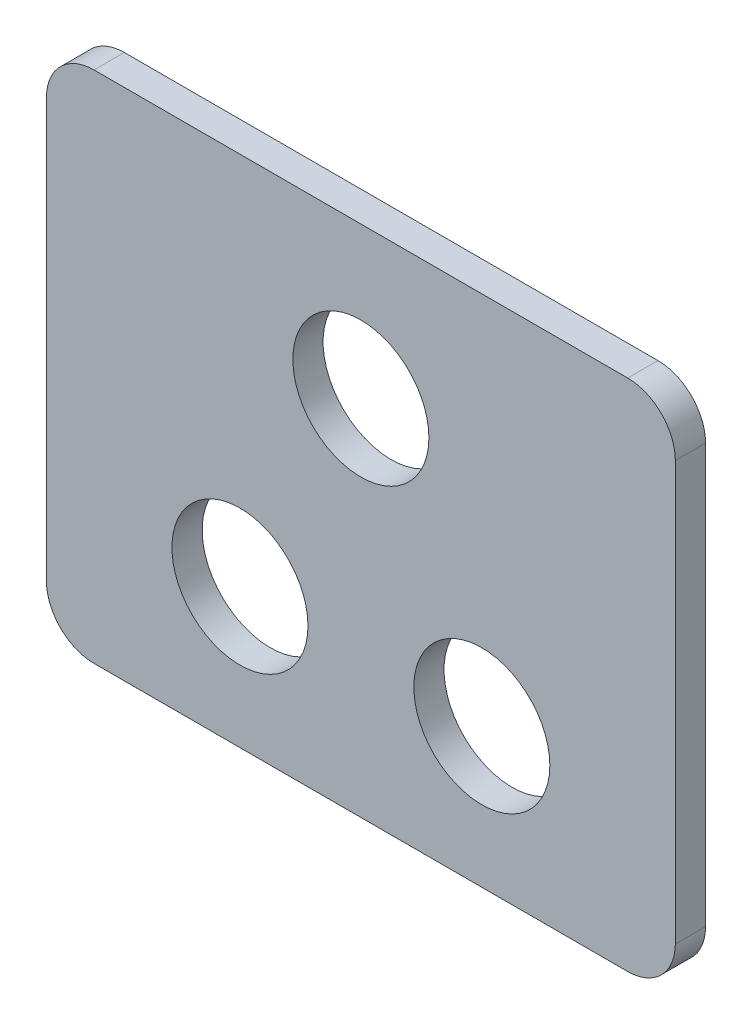
ISO-10303-21;
HEADER;
FILE_DESCRIPTION(('STEP AP214'),'2;1');
FILE_NAME('part.step','',(''),(''),'','','');
FILE_SCHEMA(('AUTOMOTIVE_DESIGN { 1 0 10303 214 1 1 1 1 }'));
ENDSEC;
DATA;
#1=APPLICATION_CONTEXT('core data for automotive mechanical design processes');
#2=APPLICATION_PROTOCOL_DEFINITION('international standard','automotive_design',2000,#1);
#3=PRODUCT_CONTEXT('',#1,'mechanical');
#4=PRODUCT('Part','Part','',(#3));
#5=PRODUCT_RELATED_PRODUCT_CATEGORY('part','',(#4));
#6=PRODUCT_DEFINITION_FORMATION('','',#4);
#7=PRODUCT_DEFINITION_CONTEXT('part definition',#1,'design');
#8=PRODUCT_DEFINITION('design','',#6,#7);
#9=PRODUCT_DEFINITION_SHAPE('','',#8);
#10=(LENGTH_UNIT() NAMED_UNIT(*) SI_UNIT(.MILLI.,.METRE.));
#11=(NAMED_UNIT(*) PLANE_ANGLE_UNIT() SI_UNIT($,.RADIAN.));
#12=(NAMED_UNIT(*) SI_UNIT($,.STERADIAN.) SOLID_ANGLE_UNIT());
#13=UNCERTAINTY_MEASURE_WITH_UNIT(LENGTH_MEASURE(1.E-05),#10,'distance_accuracy_value','');
#14=(GEOMETRIC_REPRESENTATION_CONTEXT(3) GLOBAL_UNCERTAINTY_ASSIGNED_CONTEXT((#13)) GLOBAL_UNIT_ASSIGNED_CONTEXT((#10,
#11,#12)) REPRESENTATION_CONTEXT('',''));
#15=CARTESIAN_POINT('',(0.,0.,0.));
#16=DIRECTION('',(0.,0.,1.));
#17=DIRECTION('',(1.,0.,0.));
#18=AXIS2_PLACEMENT_3D('',#15,#16,#17);
#19=CARTESIAN_POINT('',(32.0626569531529,-35.3645038979217,6.35));
#20=DIRECTION('',(0.,0.,-1.));
#21=DIRECTION('',(-1.,0.,0.));
#22=AXIS2_PLACEMENT_3D('',#19,#20,#21);
#23=CYLINDRICAL_SURFACE('',#22,10.);
#24=CARTESIAN_POINT('',(32.0626569531529,-35.3645038979217,0.));
#25=DIRECTION('',(0.,0.,1.));
#26=DIRECTION('',(1.,0.,0.));
#27=AXIS2_PLACEMENT_3D('',#24,#25,#26);
#28=CIRCLE('',#27,10.);
#29=CARTESIAN_POINT('',(32.0626569531529,-25.3645038979217,0.));
#30=VERTEX_POINT('',#29);
#31=CARTESIAN_POINT('',(42.0626569531529,-35.3645038979217,0.));
#32=VERTEX_POINT('',#31);
#33=EDGE_CURVE('E159',#30,#32,#28,.F.);
#34=ORIENTED_EDGE('',*,*,#33,.F.);
#35=DIRECTION('',(0.,0.,-1.));
#36=VECTOR('',#35,1.);
#37=CARTESIAN_POINT('',(32.0626569531529,-25.3645038979217,6.35));
#38=LINE('',#37,#36);
#39=CARTESIAN_POINT('',(32.0626569531529,-25.3645038979217,6.35));
#40=VERTEX_POINT('',#39);
#41=EDGE_CURVE('E11',#40,#30,#38,.T.);
#42=ORIENTED_EDGE('',*,*,#41,.F.);
#43=CARTESIAN_POINT('',(32.0626569531529,-35.3645038979217,6.35));
#44=DIRECTION('',(0.,0.,1.));
#45=DIRECTION('',(1.,0.,0.));
#46=AXIS2_PLACEMENT_3D('',#43,#44,#45);
#47=CIRCLE('',#46,10.);
#48=CARTESIAN_POINT('',(42.0626569531529,-35.3645038979217,6.35));
#49=VERTEX_POINT('',#48);
#50=EDGE_CURVE('E236',#40,#49,#47,.F.);
#51=ORIENTED_EDGE('',*,*,#50,.T.);
#52=DIRECTION('',(0.,0.,-1.));
#53=VECTOR('',#52,1.);
#54=CARTESIAN_POINT('',(42.0626569531529,-35.3645038979217,6.35));
#55=LINE('',#54,#53);
#56=EDGE_CURVE('E54',#49,#32,#55,.T.);
#57=ORIENTED_EDGE('',*,*,#56,.T.);
#58=EDGE_LOOP('',(#34,#42,#51,#57));
#59=FACE_BOUND('',#58,.T.);
#60=ADVANCED_FACE('F37',(#59),#23,.T.);
#61=CARTESIAN_POINT('',(0.,-25.3645038979217,6.35));
#62=DIRECTION('',(0.,1.,0.));
#63=DIRECTION('',(0.,0.,1.));
#64=AXIS2_PLACEMENT_3D('',#61,#62,#63);
#65=PLANE('',#64);
#66=DIRECTION('',(1.,0.,0.));
#67=VECTOR('',#66,1.);
#68=CARTESIAN_POINT('',(0.,-25.3645038979217,0.));
#69=LINE('',#68,#67);
#70=CARTESIAN_POINT('',(-80.0173430468471,-25.3645038979217,0.));
#71=VERTEX_POINT('',#70);
#72=EDGE_CURVE('E154',#71,#30,#69,.T.);
#73=ORIENTED_EDGE('',*,*,#72,.F.);
#74=DIRECTION('',(0.,0.,-1.));
#75=VECTOR('',#74,1.);
#76=CARTESIAN_POINT('',(-80.0173430468471,-25.3645038979217,6.35));
#77=LINE('',#76,#75);
#78=CARTESIAN_POINT('',(-80.0173430468471,-25.3645038979217,6.35));
#79=VERTEX_POINT('',#78);
#80=EDGE_CURVE('E46',#79,#71,#77,.T.);
#81=ORIENTED_EDGE('',*,*,#80,.F.);
#82=DIRECTION('',(1.,0.,0.));
#83=VECTOR('',#82,1.);
#84=CARTESIAN_POINT('',(0.,-25.3645038979217,6.35));
#85=LINE('',#84,#83);
#86=EDGE_CURVE('E238',#79,#40,#85,.T.);
#87=ORIENTED_EDGE('',*,*,#86,.T.);
#88=ORIENTED_EDGE('',*,*,#41,.T.);
#89=EDGE_LOOP('',(#73,#81,#87,#88));
#90=FACE_BOUND('',#89,.T.);
#91=ADVANCED_FACE('F158',(#90),#65,.T.);
#92=CARTESIAN_POINT('',(-80.0173430468471,-35.3645038979217,6.35));
#93=DIRECTION('',(0.,0.,-1.));
#94=DIRECTION('',(-1.,0.,0.));
#95=AXIS2_PLACEMENT_3D('',#92,#93,#94);
#96=CYLINDRICAL_SURFACE('',#95,10.);
#97=CARTESIAN_POINT('',(-80.0173430468471,-35.3645038979217,0.));
#98=DIRECTION('',(0.,0.,1.));
#99=DIRECTION('',(1.,0.,0.));
#100=AXIS2_PLACEMENT_3D('',#97,#98,#99);
#101=CIRCLE('',#100,10.);
#102=CARTESIAN_POINT('',(-90.0173430468471,-35.3645038979217,0.));
#103=VERTEX_POINT('',#102);
#104=EDGE_CURVE('E143',#71,#103,#101,.T.);
#105=ORIENTED_EDGE('',*,*,#104,.T.);
#106=DIRECTION('',(0.,0.,-1.));
#107=VECTOR('',#106,1.);
#108=CARTESIAN_POINT('',(-90.0173430468471,-35.3645038979217,6.35));
#109=LINE('',#108,#107);
#110=CARTESIAN_POINT('',(-90.0173430468471,-35.3645038979217,6.35));
#111=VERTEX_POINT('',#110);
#112=EDGE_CURVE('E135',#111,#103,#109,.T.);
#113=ORIENTED_EDGE('',*,*,#112,.F.);
#114=CARTESIAN_POINT('',(-80.0173430468471,-35.3645038979217,6.35));
#115=DIRECTION('',(0.,0.,1.));
#116=DIRECTION('',(1.,0.,0.));
#117=AXIS2_PLACEMENT_3D('',#114,#115,#116);
#118=CIRCLE('',#117,10.);
#119=EDGE_CURVE('E145',#79,#111,#118,.T.);
#120=ORIENTED_EDGE('',*,*,#119,.F.);
#121=ORIENTED_EDGE('',*,*,#80,.T.);
#122=EDGE_LOOP('',(#105,#113,#120,#121));
#123=FACE_BOUND('',#122,.T.);
#124=ADVANCED_FACE('F141',(#123),#96,.T.);
#125=CARTESIAN_POINT('',(-90.0173430468471,0.,6.35));
#126=DIRECTION('',(1.,0.,0.));
#127=DIRECTION('',(0.,1.,0.));
#128=AXIS2_PLACEMENT_3D('',#125,#126,#127);
#129=PLANE('',#128);
#130=DIRECTION('',(0.,-1.,0.));
#131=VECTOR('',#130,1.);
#132=CARTESIAN_POINT('',(-90.0173430468471,0.,0.));
#133=LINE('',#132,#131);
#134=CARTESIAN_POINT('',(-90.0173430468471,-123.314503897922,0.));
#135=VERTEX_POINT('',#134);
#136=EDGE_CURVE('E156',#103,#135,#133,.T.);
#137=ORIENTED_EDGE('',*,*,#136,.T.);
#138=DIRECTION('',(0.,0.,-1.));
#139=VECTOR('',#138,1.);
#140=CARTESIAN_POINT('',(-90.0173430468471,-123.314503897922,6.35));
#141=LINE('',#140,#139);
#142=CARTESIAN_POINT('',(-90.0173430468471,-123.314503897922,6.35));
#143=VERTEX_POINT('',#142);
#144=EDGE_CURVE('E128',#143,#135,#141,.T.);
#145=ORIENTED_EDGE('',*,*,#144,.F.);
#146=DIRECTION('',(0.,-1.,0.));
#147=VECTOR('',#146,1.);
#148=CARTESIAN_POINT('',(-90.0173430468471,0.,6.35));
#149=LINE('',#148,#147);
#150=EDGE_CURVE('E243',#111,#143,#149,.T.);
#151=ORIENTED_EDGE('',*,*,#150,.F.);
#152=ORIENTED_EDGE('',*,*,#112,.T.);
#153=EDGE_LOOP('',(#137,#145,#151,#152));
#154=FACE_BOUND('',#153,.T.);
#155=ADVANCED_FACE('F214',(#154),#129,.F.);
#156=CARTESIAN_POINT('',(-80.0173430468471,-123.314503897922,6.35));
#157=DIRECTION('',(0.,0.,-1.));
#158=DIRECTION('',(-1.,0.,0.));
#159=AXIS2_PLACEMENT_3D('',#156,#157,#158);
#160=CYLINDRICAL_SURFACE('',#159,9.99999999999999);
#161=CARTESIAN_POINT('',(-80.0173430468471,-123.314503897922,0.));
#162=DIRECTION('',(0.,0.,1.));
#163=DIRECTION('',(1.,0.,0.));
#164=AXIS2_PLACEMENT_3D('',#161,#162,#163);
#165=CIRCLE('',#164,9.99999999999999);
#166=CARTESIAN_POINT('',(-80.0173430468471,-133.314503897922,0.));
#167=VERTEX_POINT('',#166);
#168=EDGE_CURVE('E166',#135,#167,#165,.T.);
#169=ORIENTED_EDGE('',*,*,#168,.T.);
#170=DIRECTION('',(0.,0.,-1.));
#171=VECTOR('',#170,1.);
#172=CARTESIAN_POINT('',(-80.0173430468471,-133.314503897922,6.35));
#173=LINE('',#172,#171);
#174=CARTESIAN_POINT('',(-80.0173430468471,-133.314503897922,6.35));
#175=VERTEX_POINT('',#174);
#176=EDGE_CURVE('E126',#175,#167,#173,.T.);
#177=ORIENTED_EDGE('',*,*,#176,.F.);
#178=CARTESIAN_POINT('',(-80.0173430468471,-123.314503897922,6.35));
#179=DIRECTION('',(0.,0.,1.));
#180=DIRECTION('',(1.,0.,0.));
#181=AXIS2_PLACEMENT_3D('',#178,#179,#180);
#182=CIRCLE('',#181,9.99999999999999);
#183=EDGE_CURVE('E119',#143,#175,#182,.T.);
#184=ORIENTED_EDGE('',*,*,#183,.F.);
#185=ORIENTED_EDGE('',*,*,#144,.T.);
#186=EDGE_LOOP('',(#169,#177,#184,#185));
#187=FACE_BOUND('',#186,.T.);
#188=ADVANCED_FACE('F217',(#187),#160,.T.);
#189=CARTESIAN_POINT('',(0.,-133.314503897922,6.35));
#190=DIRECTION('',(0.,1.,0.));
#191=DIRECTION('',(0.,0.,1.));
#192=AXIS2_PLACEMENT_3D('',#189,#190,#191);
#193=PLANE('',#192);
#194=DIRECTION('',(1.,0.,0.));
#195=VECTOR('',#194,1.);
#196=CARTESIAN_POINT('',(0.,-133.314503897922,0.));
#197=LINE('',#196,#195);
#198=CARTESIAN_POINT('',(32.0626569531529,-133.314503897922,0.));
#199=VERTEX_POINT('',#198);
#200=EDGE_CURVE('E125',#167,#199,#197,.T.);
#201=ORIENTED_EDGE('',*,*,#200,.T.);
#202=DIRECTION('',(0.,0.,-1.));
#203=VECTOR('',#202,1.);
#204=CARTESIAN_POINT('',(32.0626569531529,-133.314503897922,6.35));
#205=LINE('',#204,#203);
#206=CARTESIAN_POINT('',(32.0626569531529,-133.314503897922,6.35));
#207=VERTEX_POINT('',#206);
#208=EDGE_CURVE('E108',#207,#199,#205,.T.);
#209=ORIENTED_EDGE('',*,*,#208,.F.);
#210=DIRECTION('',(1.,0.,0.));
#211=VECTOR('',#210,1.);
#212=CARTESIAN_POINT('',(0.,-133.314503897922,6.35));
#213=LINE('',#212,#211);
#214=EDGE_CURVE('E113',#175,#207,#213,.T.);
#215=ORIENTED_EDGE('',*,*,#214,.F.);
#216=ORIENTED_EDGE('',*,*,#176,.T.);
#217=EDGE_LOOP('',(#201,#209,#215,#216));
#218=FACE_BOUND('',#217,.T.);
#219=ADVANCED_FACE('F124',(#218),#193,.F.);
#220=CARTESIAN_POINT('',(32.0626569531529,-123.314503897922,6.35));
#221=DIRECTION('',(0.,0.,-1.));
#222=DIRECTION('',(-1.,0.,0.));
#223=AXIS2_PLACEMENT_3D('',#220,#221,#222);
#224=CYLINDRICAL_SURFACE('',#223,9.99999999999999);
#225=CARTESIAN_POINT('',(32.0626569531529,-123.314503897922,0.));
#226=DIRECTION('',(0.,0.,1.));
#227=DIRECTION('',(1.,0.,0.));
#228=AXIS2_PLACEMENT_3D('',#225,#226,#227);
#229=CIRCLE('',#228,9.99999999999999);
#230=CARTESIAN_POINT('',(42.0626569531529,-123.314503897922,0.));
#231=VERTEX_POINT('',#230);
#232=EDGE_CURVE('E170',#199,#231,#229,.T.);
#233=ORIENTED_EDGE('',*,*,#232,.T.);
#234=DIRECTION('',(0.,0.,-1.));
#235=VECTOR('',#234,1.);
#236=CARTESIAN_POINT('',(42.0626569531529,-123.314503897922,6.35));
#237=LINE('',#236,#235);
#238=CARTESIAN_POINT('',(42.0626569531529,-123.314503897922,6.35));
#239=VERTEX_POINT('',#238);
#240=EDGE_CURVE('E80',#239,#231,#237,.T.);
#241=ORIENTED_EDGE('',*,*,#240,.F.);
#242=CARTESIAN_POINT('',(32.0626569531529,-123.314503897922,6.35));
#243=DIRECTION('',(0.,0.,1.));
#244=DIRECTION('',(1.,0.,0.));
#245=AXIS2_PLACEMENT_3D('',#242,#243,#244);
#246=CIRCLE('',#245,9.99999999999999);
#247=EDGE_CURVE('E104',#207,#239,#246,.T.);
#248=ORIENTED_EDGE('',*,*,#247,.F.);
#249=ORIENTED_EDGE('',*,*,#208,.T.);
#250=EDGE_LOOP('',(#233,#241,#248,#249));
#251=FACE_BOUND('',#250,.T.);
#252=ADVANCED_FACE('F106',(#251),#224,.T.);
#253=CARTESIAN_POINT('',(-49.3773430468471,-104.018614591975,6.35));
#254=DIRECTION('',(0.,0.,-1.));
#255=DIRECTION('',(-1.,0.,0.));
#256=AXIS2_PLACEMENT_3D('',#253,#254,#255);
#257=CYLINDRICAL_SURFACE('',#256,14.2875);
#258=CARTESIAN_POINT('',(-49.3773430468471,-104.018614591975,6.35));
#259=DIRECTION('',(0.,0.,1.));
#260=DIRECTION('',(1.,0.,0.));
#261=AXIS2_PLACEMENT_3D('',#258,#259,#260);
#262=CIRCLE('',#261,14.2875);
#263=CARTESIAN_POINT('',(-35.0898430468471,-104.018614591975,6.35));
#264=VERTEX_POINT('',#263);
#265=EDGE_CURVE('E183',#264,#264,#262,.T.);
#266=ORIENTED_EDGE('',*,*,#265,.T.);
#267=EDGE_LOOP('',(#266));
#268=FACE_BOUND('',#267,.T.);
#269=CARTESIAN_POINT('',(-49.3773430468471,-104.018614591975,0.));
#270=DIRECTION('',(0.,0.,1.));
#271=DIRECTION('',(1.,0.,0.));
#272=AXIS2_PLACEMENT_3D('',#269,#270,#271);
#273=CIRCLE('',#272,14.2875);
#274=CARTESIAN_POINT('',(-35.0898430468471,-104.018614591975,0.));
#275=VERTEX_POINT('',#274);
#276=EDGE_CURVE('E175',#275,#275,#273,.T.);
#277=ORIENTED_EDGE('',*,*,#276,.F.);
#278=EDGE_LOOP('',(#277));
#279=FACE_BOUND('',#278,.T.);
#280=ADVANCED_FACE('F203',(#268,#279),#257,.F.);
#281=CARTESIAN_POINT('',(42.0626569531529,0.,6.35));
#282=DIRECTION('',(1.,0.,0.));
#283=DIRECTION('',(0.,1.,0.));
#284=AXIS2_PLACEMENT_3D('',#281,#282,#283);
#285=PLANE('',#284);
#286=DIRECTION('',(0.,-1.,0.));
#287=VECTOR('',#286,1.);
#288=CARTESIAN_POINT('',(42.0626569531529,0.,0.));
#289=LINE('',#288,#287);
#290=EDGE_CURVE('E172',#32,#231,#289,.T.);
#291=ORIENTED_EDGE('',*,*,#290,.F.);
#292=ORIENTED_EDGE('',*,*,#56,.F.);
#293=DIRECTION('',(0.,-1.,0.));
#294=VECTOR('',#293,1.);
#295=CARTESIAN_POINT('',(42.0626569531529,0.,6.35));
#296=LINE('',#295,#294);
#297=EDGE_CURVE('E112',#49,#239,#296,.T.);
#298=ORIENTED_EDGE('',*,*,#297,.T.);
#299=ORIENTED_EDGE('',*,*,#240,.T.);
#300=EDGE_LOOP('',(#291,#292,#298,#299));
#301=FACE_BOUND('',#300,.T.);
#302=ADVANCED_FACE('F196',(#301),#285,.T.);
#303=CARTESIAN_POINT('',(1.4226569531529,-104.018614591975,6.35));
#304=DIRECTION('',(0.,0.,-1.));
#305=DIRECTION('',(-1.,0.,0.));
#306=AXIS2_PLACEMENT_3D('',#303,#304,#305);
#307=CYLINDRICAL_SURFACE('',#306,14.2875);
#308=CARTESIAN_POINT('',(1.4226569531529,-104.018614591975,6.35));
#309=DIRECTION('',(0.,0.,1.));
#310=DIRECTION('',(1.,0.,0.));
#311=AXIS2_PLACEMENT_3D('',#308,#309,#310);
#312=CIRCLE('',#311,14.2875);
#313=CARTESIAN_POINT('',(15.7101569531529,-104.018614591975,6.35));
#314=VERTEX_POINT('',#313);
#315=EDGE_CURVE('E180',#314,#314,#312,.T.);
#316=ORIENTED_EDGE('',*,*,#315,.T.);
#317=EDGE_LOOP('',(#316));
#318=FACE_BOUND('',#317,.T.);
#319=CARTESIAN_POINT('',(1.4226569531529,-104.018614591975,0.));
#320=DIRECTION('',(0.,0.,1.));
#321=DIRECTION('',(1.,0.,0.));
#322=AXIS2_PLACEMENT_3D('',#319,#320,#321);
#323=CIRCLE('',#322,14.2875);
#324=CARTESIAN_POINT('',(15.7101569531529,-104.018614591975,0.));
#325=VERTEX_POINT('',#324);
#326=EDGE_CURVE('E161',#325,#325,#323,.T.);
#327=ORIENTED_EDGE('',*,*,#326,.F.);
#328=EDGE_LOOP('',(#327));
#329=FACE_BOUND('',#328,.T.);
#330=ADVANCED_FACE('F39',(#318,#329),#307,.F.);
#331=CARTESIAN_POINT('',(-23.9773430468471,-57.1145038979217,6.35));
#332=DIRECTION('',(0.,0.,-1.));
#333=DIRECTION('',(-1.,0.,0.));
#334=AXIS2_PLACEMENT_3D('',#331,#332,#333);
#335=CYLINDRICAL_SURFACE('',#334,14.2875);
#336=CARTESIAN_POINT('',(-23.9773430468471,-57.1145038979217,6.35));
#337=DIRECTION('',(0.,0.,1.));
#338=DIRECTION('',(1.,0.,0.));
#339=AXIS2_PLACEMENT_3D('',#336,#337,#338);
#340=CIRCLE('',#339,14.2875);
#341=CARTESIAN_POINT('',(-9.68984304684709,-57.1145038979217,6.35));
#342=VERTEX_POINT('',#341);
#343=EDGE_CURVE('E181',#342,#342,#340,.T.);
#344=ORIENTED_EDGE('',*,*,#343,.T.);
#345=EDGE_LOOP('',(#344));
#346=FACE_BOUND('',#345,.T.);
#347=CARTESIAN_POINT('',(-23.9773430468471,-57.1145038979217,0.));
#348=DIRECTION('',(0.,0.,1.));
#349=DIRECTION('',(1.,0.,0.));
#350=AXIS2_PLACEMENT_3D('',#347,#348,#349);
#351=CIRCLE('',#350,14.2875);
#352=CARTESIAN_POINT('',(-9.68984304684709,-57.1145038979217,0.));
#353=VERTEX_POINT('',#352);
#354=EDGE_CURVE('E178',#353,#353,#351,.T.);
#355=ORIENTED_EDGE('',*,*,#354,.F.);
#356=EDGE_LOOP('',(#355));
#357=FACE_BOUND('',#356,.T.);
#358=ADVANCED_FACE('F195',(#346,#357),#335,.F.);
#359=CARTESIAN_POINT('',(0.,0.,6.35));
#360=DIRECTION('',(0.,0.,1.));
#361=DIRECTION('',(1.,0.,0.));
#362=AXIS2_PLACEMENT_3D('',#359,#360,#361);
#363=PLANE('',#362);
#364=ORIENTED_EDGE('',*,*,#315,.F.);
#365=EDGE_LOOP('',(#364));
#366=FACE_BOUND('',#365,.T.);
#367=ORIENTED_EDGE('',*,*,#50,.F.);
#368=ORIENTED_EDGE('',*,*,#86,.F.);
#369=ORIENTED_EDGE('',*,*,#119,.T.);
#370=ORIENTED_EDGE('',*,*,#150,.T.);
#371=ORIENTED_EDGE('',*,*,#183,.T.);
#372=ORIENTED_EDGE('',*,*,#214,.T.);
#373=ORIENTED_EDGE('',*,*,#247,.T.);
#374=ORIENTED_EDGE('',*,*,#297,.F.);
#375=EDGE_LOOP('',(#367,#368,#369,#370,#371,#372,#373,#374));
#376=FACE_BOUND('',#375,.T.);
#377=ORIENTED_EDGE('',*,*,#265,.F.);
#378=EDGE_LOOP('',(#377));
#379=FACE_BOUND('',#378,.T.);
#380=ORIENTED_EDGE('',*,*,#343,.F.);
#381=EDGE_LOOP('',(#380));
#382=FACE_BOUND('',#381,.T.);
#383=ADVANCED_FACE('F116',(#366,#376,#379,#382),#363,.T.);
#384=CARTESIAN_POINT('',(0.,0.,0.));
#385=DIRECTION('',(0.,0.,1.));
#386=DIRECTION('',(1.,0.,0.));
#387=AXIS2_PLACEMENT_3D('',#384,#385,#386);
#388=PLANE('',#387);
#389=ORIENTED_EDGE('',*,*,#326,.T.);
#390=EDGE_LOOP('',(#389));
#391=FACE_BOUND('',#390,.T.);
#392=ORIENTED_EDGE('',*,*,#33,.T.);
#393=ORIENTED_EDGE('',*,*,#290,.T.);
#394=ORIENTED_EDGE('',*,*,#232,.F.);
#395=ORIENTED_EDGE('',*,*,#200,.F.);
#396=ORIENTED_EDGE('',*,*,#168,.F.);
#397=ORIENTED_EDGE('',*,*,#136,.F.);
#398=ORIENTED_EDGE('',*,*,#104,.F.);
#399=ORIENTED_EDGE('',*,*,#72,.T.);
#400=EDGE_LOOP('',(#392,#393,#394,#395,#396,#397,#398,#399));
#401=FACE_BOUND('',#400,.T.);
#402=ORIENTED_EDGE('',*,*,#276,.T.);
#403=EDGE_LOOP('',(#402));
#404=FACE_BOUND('',#403,.T.);
#405=ORIENTED_EDGE('',*,*,#354,.T.);
#406=EDGE_LOOP('',(#405));
#407=FACE_BOUND('',#406,.T.);
#408=ADVANCED_FACE('F152',(#391,#401,#404,#407),#388,.F.);
#409=CLOSED_SHELL('',(#60,#91,#124,#155,#188,#219,#252,#280,#302,#330,#358,#383,#408));
#410=MANIFOLD_SOLID_BREP('B2',#409);
#411=ADVANCED_BREP_SHAPE_REPRESENTATION('',(#18,#410),#14);
#412=SHAPE_DEFINITION_REPRESENTATION(#9,#411);
ENDSEC;
END-ISO-10303-21;
